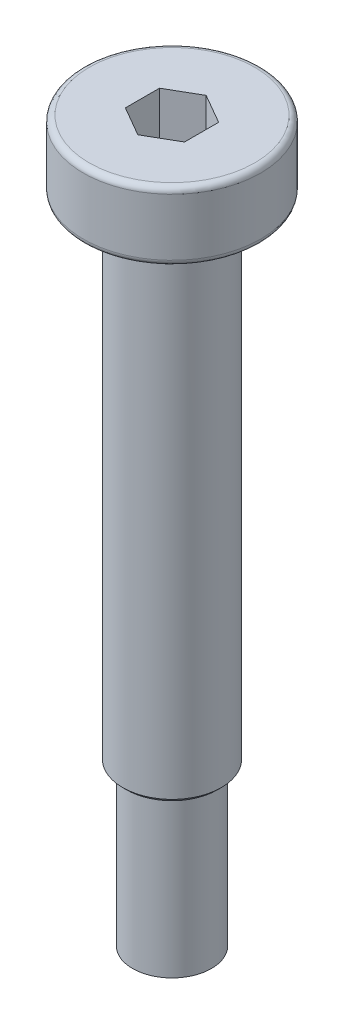
ISO-10303-21;
HEADER;
FILE_DESCRIPTION(('STEP AP214'),'2;1');
FILE_NAME('part.step','',(''),(''),'','','');
FILE_SCHEMA(('AUTOMOTIVE_DESIGN { 1 0 10303 214 1 1 1 1 }'));
ENDSEC;
DATA;
#1=APPLICATION_CONTEXT('core data for automotive mechanical design processes');
#2=APPLICATION_PROTOCOL_DEFINITION('international standard','automotive_design',2000,#1);
#3=PRODUCT_CONTEXT('',#1,'mechanical');
#4=PRODUCT('Part','Part','',(#3));
#5=PRODUCT_RELATED_PRODUCT_CATEGORY('part','',(#4));
#6=PRODUCT_DEFINITION_FORMATION('','',#4);
#7=PRODUCT_DEFINITION_CONTEXT('part definition',#1,'design');
#8=PRODUCT_DEFINITION('design','',#6,#7);
#9=PRODUCT_DEFINITION_SHAPE('','',#8);
#10=(LENGTH_UNIT() NAMED_UNIT(*) SI_UNIT(.MILLI.,.METRE.));
#11=(NAMED_UNIT(*) PLANE_ANGLE_UNIT() SI_UNIT($,.RADIAN.));
#12=(NAMED_UNIT(*) SI_UNIT($,.STERADIAN.) SOLID_ANGLE_UNIT());
#13=UNCERTAINTY_MEASURE_WITH_UNIT(LENGTH_MEASURE(1.E-05),#10,'distance_accuracy_value','');
#14=(GEOMETRIC_REPRESENTATION_CONTEXT(3) GLOBAL_UNCERTAINTY_ASSIGNED_CONTEXT((#13)) GLOBAL_UNIT_ASSIGNED_CONTEXT((#10,
#11,#12)) REPRESENTATION_CONTEXT('',''));
#15=CARTESIAN_POINT('',(0.,0.,0.));
#16=DIRECTION('',(0.,0.,1.));
#17=DIRECTION('',(1.,0.,0.));
#18=AXIS2_PLACEMENT_3D('',#15,#16,#17);
#19=CARTESIAN_POINT('',(0.,3.5,0.));
#20=DIRECTION('',(0.,1.,0.));
#21=DIRECTION('',(-1.,0.,0.));
#22=AXIS2_PLACEMENT_3D('',#19,#20,#21);
#23=CYLINDRICAL_SURFACE('',#22,4.5);
#24=CARTESIAN_POINT('',(0.,0.3,0.));
#25=DIRECTION('',(0.,-1.,0.));
#26=DIRECTION('',(1.,0.,0.));
#27=AXIS2_PLACEMENT_3D('',#24,#25,#26);
#28=CIRCLE('',#27,4.5);
#29=CARTESIAN_POINT('',(4.5,0.300000000000001,0.));
#30=VERTEX_POINT('',#29);
#31=EDGE_CURVE('E188',#30,#30,#28,.F.);
#32=ORIENTED_EDGE('',*,*,#31,.T.);
#33=EDGE_LOOP('',(#32));
#34=FACE_BOUND('',#33,.T.);
#35=CARTESIAN_POINT('',(0.,3.2,0.));
#36=DIRECTION('',(0.,1.,0.));
#37=DIRECTION('',(-1.,0.,0.));
#38=AXIS2_PLACEMENT_3D('',#35,#36,#37);
#39=CIRCLE('',#38,4.5);
#40=CARTESIAN_POINT('',(-4.5,3.2,0.));
#41=VERTEX_POINT('',#40);
#42=EDGE_CURVE('E184',#41,#41,#39,.F.);
#43=ORIENTED_EDGE('',*,*,#42,.T.);
#44=EDGE_LOOP('',(#43));
#45=FACE_BOUND('',#44,.T.);
#46=ADVANCED_FACE('F47',(#34,#45),#23,.T.);
#47=CARTESIAN_POINT('',(-4.5,0.,0.));
#48=DIRECTION('',(0.,-1.,0.));
#49=DIRECTION('',(1.,0.,0.));
#50=AXIS2_PLACEMENT_3D('',#47,#48,#49);
#51=PLANE('',#50);
#52=CARTESIAN_POINT('',(0.,0.,0.));
#53=DIRECTION('',(0.,-1.,0.));
#54=DIRECTION('',(1.,0.,0.));
#55=AXIS2_PLACEMENT_3D('',#52,#53,#54);
#56=CIRCLE('',#55,4.2);
#57=CARTESIAN_POINT('',(4.2,0.,0.));
#58=VERTEX_POINT('',#57);
#59=EDGE_CURVE('E192',#58,#58,#56,.T.);
#60=ORIENTED_EDGE('',*,*,#59,.T.);
#61=EDGE_LOOP('',(#60));
#62=FACE_BOUND('',#61,.T.);
#63=CARTESIAN_POINT('',(0.,0.,0.));
#64=DIRECTION('',(0.,1.,0.));
#65=DIRECTION('',(-1.,0.,0.));
#66=AXIS2_PLACEMENT_3D('',#63,#64,#65);
#67=CIRCLE('',#66,2.5);
#68=CARTESIAN_POINT('',(-2.5,0.,0.));
#69=VERTEX_POINT('',#68);
#70=EDGE_CURVE('E180',#69,#69,#67,.T.);
#71=ORIENTED_EDGE('',*,*,#70,.T.);
#72=EDGE_LOOP('',(#71));
#73=FACE_BOUND('',#72,.T.);
#74=ADVANCED_FACE('F216',(#62,#73),#51,.T.);
#75=CARTESIAN_POINT('',(0.,3.5,0.));
#76=DIRECTION('',(0.,1.,0.));
#77=DIRECTION('',(-1.,0.,0.));
#78=AXIS2_PLACEMENT_3D('',#75,#76,#77);
#79=CYLINDRICAL_SURFACE('',#78,2.5);
#80=CARTESIAN_POINT('',(0.,-24.8,0.));
#81=DIRECTION('',(0.,-1.,0.));
#82=DIRECTION('',(1.,0.,0.));
#83=AXIS2_PLACEMENT_3D('',#80,#81,#82);
#84=CIRCLE('',#83,2.5);
#85=CARTESIAN_POINT('',(2.5,-24.8,0.));
#86=VERTEX_POINT('',#85);
#87=EDGE_CURVE('E56',#86,#86,#84,.F.);
#88=ORIENTED_EDGE('',*,*,#87,.T.);
#89=EDGE_LOOP('',(#88));
#90=FACE_BOUND('',#89,.T.);
#91=ORIENTED_EDGE('',*,*,#70,.F.);
#92=EDGE_LOOP('',(#91));
#93=FACE_BOUND('',#92,.T.);
#94=ADVANCED_FACE('F204',(#90,#93),#79,.T.);
#95=CARTESIAN_POINT('',(-2.5,-25.,0.));
#96=DIRECTION('',(0.,-1.,0.));
#97=DIRECTION('',(1.,0.,0.));
#98=AXIS2_PLACEMENT_3D('',#95,#96,#97);
#99=PLANE('',#98);
#100=CARTESIAN_POINT('',(0.,-25.,0.));
#101=DIRECTION('',(0.,-1.,0.));
#102=DIRECTION('',(1.,0.,0.));
#103=AXIS2_PLACEMENT_3D('',#100,#101,#102);
#104=CIRCLE('',#103,2.3);
#105=CARTESIAN_POINT('',(2.3,-25.,0.));
#106=VERTEX_POINT('',#105);
#107=EDGE_CURVE('E11',#106,#106,#104,.T.);
#108=ORIENTED_EDGE('',*,*,#107,.T.);
#109=EDGE_LOOP('',(#108));
#110=FACE_BOUND('',#109,.T.);
#111=CARTESIAN_POINT('',(0.,-25.,0.));
#112=DIRECTION('',(0.,1.,0.));
#113=DIRECTION('',(-1.,0.,0.));
#114=AXIS2_PLACEMENT_3D('',#111,#112,#113);
#115=CIRCLE('',#114,2.);
#116=CARTESIAN_POINT('',(-2.,-25.,0.));
#117=VERTEX_POINT('',#116);
#118=EDGE_CURVE('E176',#117,#117,#115,.T.);
#119=ORIENTED_EDGE('',*,*,#118,.T.);
#120=EDGE_LOOP('',(#119));
#121=FACE_BOUND('',#120,.T.);
#122=ADVANCED_FACE('F258',(#110,#121),#99,.T.);
#123=CARTESIAN_POINT('',(0.,3.5,0.));
#124=DIRECTION('',(0.,1.,0.));
#125=DIRECTION('',(-1.,0.,0.));
#126=AXIS2_PLACEMENT_3D('',#123,#124,#125);
#127=CYLINDRICAL_SURFACE('',#126,2.);
#128=CARTESIAN_POINT('',(0.,-33.,0.));
#129=DIRECTION('',(0.,1.,0.));
#130=DIRECTION('',(-1.,0.,0.));
#131=AXIS2_PLACEMENT_3D('',#128,#129,#130);
#132=CIRCLE('',#131,2.);
#133=CARTESIAN_POINT('',(-2.,-33.,0.));
#134=VERTEX_POINT('',#133);
#135=EDGE_CURVE('E163',#134,#134,#132,.T.);
#136=ORIENTED_EDGE('',*,*,#135,.T.);
#137=EDGE_LOOP('',(#136));
#138=FACE_BOUND('',#137,.T.);
#139=ORIENTED_EDGE('',*,*,#118,.F.);
#140=EDGE_LOOP('',(#139));
#141=FACE_BOUND('',#140,.T.);
#142=ADVANCED_FACE('F251',(#138,#141),#127,.T.);
#143=CARTESIAN_POINT('',(-2.,-33.,0.));
#144=DIRECTION('',(0.,-1.,0.));
#145=DIRECTION('',(1.,0.,0.));
#146=AXIS2_PLACEMENT_3D('',#143,#144,#145);
#147=PLANE('',#146);
#148=ORIENTED_EDGE('',*,*,#135,.F.);
#149=EDGE_LOOP('',(#148));
#150=FACE_BOUND('',#149,.T.);
#151=ADVANCED_FACE('F245',(#150),#147,.T.);
#152=CARTESIAN_POINT('',(0.,3.5,0.));
#153=DIRECTION('',(0.,1.,0.));
#154=DIRECTION('',(-1.,0.,0.));
#155=AXIS2_PLACEMENT_3D('',#152,#153,#154);
#156=PLANE('',#155);
#157=DIRECTION('',(-0.866025403784439,0.,-0.5));
#158=VECTOR('',#157,1.);
#159=CARTESIAN_POINT('',(1.5,3.5,-0.866025403784439));
#160=LINE('',#159,#158);
#161=CARTESIAN_POINT('',(1.5,3.5,-0.866025403784439));
#162=VERTEX_POINT('',#161);
#163=CARTESIAN_POINT('',(0.,3.5,-1.73205080756888));
#164=VERTEX_POINT('',#163);
#165=EDGE_CURVE('E63',#162,#164,#160,.T.);
#166=ORIENTED_EDGE('',*,*,#165,.F.);
#167=DIRECTION('',(0.,0.,-1.));
#168=VECTOR('',#167,1.);
#169=CARTESIAN_POINT('',(1.5,3.5,0.86602540378444));
#170=LINE('',#169,#168);
#171=CARTESIAN_POINT('',(1.5,3.5,0.86602540378444));
#172=VERTEX_POINT('',#171);
#173=EDGE_CURVE('E157',#172,#162,#170,.T.);
#174=ORIENTED_EDGE('',*,*,#173,.F.);
#175=DIRECTION('',(0.866025403784439,0.,-0.5));
#176=VECTOR('',#175,1.);
#177=CARTESIAN_POINT('',(0.,3.5,1.73205080756888));
#178=LINE('',#177,#176);
#179=CARTESIAN_POINT('',(0.,3.5,1.73205080756888));
#180=VERTEX_POINT('',#179);
#181=EDGE_CURVE('E154',#180,#172,#178,.T.);
#182=ORIENTED_EDGE('',*,*,#181,.F.);
#183=DIRECTION('',(0.866025403784438,0.,0.5));
#184=VECTOR('',#183,1.);
#185=CARTESIAN_POINT('',(-1.5,3.5,0.866025403784439));
#186=LINE('',#185,#184);
#187=CARTESIAN_POINT('',(-1.5,3.5,0.866025403784439));
#188=VERTEX_POINT('',#187);
#189=EDGE_CURVE('E111',#188,#180,#186,.T.);
#190=ORIENTED_EDGE('',*,*,#189,.F.);
#191=DIRECTION('',(0.,0.,1.));
#192=VECTOR('',#191,1.);
#193=CARTESIAN_POINT('',(-1.5,3.5,-0.866025403784438));
#194=LINE('',#193,#192);
#195=CARTESIAN_POINT('',(-1.5,3.5,-0.866025403784438));
#196=VERTEX_POINT('',#195);
#197=EDGE_CURVE('E148',#196,#188,#194,.T.);
#198=ORIENTED_EDGE('',*,*,#197,.F.);
#199=DIRECTION('',(-0.866025403784439,0.,0.5));
#200=VECTOR('',#199,1.);
#201=CARTESIAN_POINT('',(0.,3.5,-1.73205080756888));
#202=LINE('',#201,#200);
#203=EDGE_CURVE('E144',#164,#196,#202,.T.);
#204=ORIENTED_EDGE('',*,*,#203,.F.);
#205=EDGE_LOOP('',(#166,#174,#182,#190,#198,#204));
#206=FACE_BOUND('',#205,.T.);
#207=CARTESIAN_POINT('',(0.,3.5,0.));
#208=DIRECTION('',(0.,1.,0.));
#209=DIRECTION('',(-1.,0.,0.));
#210=AXIS2_PLACEMENT_3D('',#207,#208,#209);
#211=CIRCLE('',#210,4.2);
#212=CARTESIAN_POINT('',(-4.2,3.5,0.));
#213=VERTEX_POINT('',#212);
#214=EDGE_CURVE('E196',#213,#213,#211,.T.);
#215=ORIENTED_EDGE('',*,*,#214,.T.);
#216=EDGE_LOOP('',(#215));
#217=FACE_BOUND('',#216,.T.);
#218=ADVANCED_FACE('F230',(#206,#217),#156,.T.);
#219=CARTESIAN_POINT('',(0.,0.3,0.));
#220=DIRECTION('',(0.,-1.,0.));
#221=DIRECTION('',(1.,0.,0.));
#222=AXIS2_PLACEMENT_3D('',#219,#220,#221);
#223=TOROIDAL_SURFACE('',#222,4.2,0.3);
#224=ORIENTED_EDGE('',*,*,#59,.F.);
#225=EDGE_LOOP('',(#224));
#226=FACE_BOUND('',#225,.T.);
#227=ORIENTED_EDGE('',*,*,#31,.F.);
#228=EDGE_LOOP('',(#227));
#229=FACE_BOUND('',#228,.T.);
#230=ADVANCED_FACE('F227',(#226,#229),#223,.T.);
#231=CARTESIAN_POINT('',(0.,3.2,0.));
#232=DIRECTION('',(0.,1.,0.));
#233=DIRECTION('',(-1.,0.,0.));
#234=AXIS2_PLACEMENT_3D('',#231,#232,#233);
#235=TOROIDAL_SURFACE('',#234,4.2,0.3);
#236=ORIENTED_EDGE('',*,*,#42,.F.);
#237=EDGE_LOOP('',(#236));
#238=FACE_BOUND('',#237,.T.);
#239=ORIENTED_EDGE('',*,*,#214,.F.);
#240=EDGE_LOOP('',(#239));
#241=FACE_BOUND('',#240,.T.);
#242=ADVANCED_FACE('F229',(#238,#241),#235,.T.);
#243=CARTESIAN_POINT('',(1.5,1.1,-0.866025403784439));
#244=DIRECTION('',(0.5,0.,-0.866025403784439));
#245=DIRECTION('',(-0.866025403784439,0.,-0.5));
#246=AXIS2_PLACEMENT_3D('',#243,#244,#245);
#247=PLANE('',#246);
#248=ORIENTED_EDGE('',*,*,#165,.T.);
#249=DIRECTION('',(0.,1.,0.));
#250=VECTOR('',#249,1.);
#251=CARTESIAN_POINT('',(0.,1.1,-1.73205080756888));
#252=LINE('',#251,#250);
#253=CARTESIAN_POINT('',(0.,1.1,-1.73205080756888));
#254=VERTEX_POINT('',#253);
#255=EDGE_CURVE('E93',#254,#164,#252,.T.);
#256=ORIENTED_EDGE('',*,*,#255,.F.);
#257=DIRECTION('',(-0.866025403784439,0.,-0.5));
#258=VECTOR('',#257,1.);
#259=CARTESIAN_POINT('',(1.5,1.1,-0.866025403784439));
#260=LINE('',#259,#258);
#261=CARTESIAN_POINT('',(1.5,1.1,-0.866025403784439));
#262=VERTEX_POINT('',#261);
#263=EDGE_CURVE('E160',#262,#254,#260,.T.);
#264=ORIENTED_EDGE('',*,*,#263,.F.);
#265=DIRECTION('',(0.,1.,0.));
#266=VECTOR('',#265,1.);
#267=CARTESIAN_POINT('',(1.5,1.1,-0.866025403784439));
#268=LINE('',#267,#266);
#269=EDGE_CURVE('E71',#262,#162,#268,.T.);
#270=ORIENTED_EDGE('',*,*,#269,.T.);
#271=EDGE_LOOP('',(#248,#256,#264,#270));
#272=FACE_BOUND('',#271,.T.);
#273=ADVANCED_FACE('F233',(#272),#247,.F.);
#274=CARTESIAN_POINT('',(1.5,1.1,0.86602540378444));
#275=DIRECTION('',(1.,0.,0.));
#276=DIRECTION('',(0.,1.,0.));
#277=AXIS2_PLACEMENT_3D('',#274,#275,#276);
#278=PLANE('',#277);
#279=ORIENTED_EDGE('',*,*,#173,.T.);
#280=ORIENTED_EDGE('',*,*,#269,.F.);
#281=DIRECTION('',(0.,0.,-1.));
#282=VECTOR('',#281,1.);
#283=CARTESIAN_POINT('',(1.5,1.1,0.86602540378444));
#284=LINE('',#283,#282);
#285=CARTESIAN_POINT('',(1.5,1.1,0.86602540378444));
#286=VERTEX_POINT('',#285);
#287=EDGE_CURVE('E125',#286,#262,#284,.T.);
#288=ORIENTED_EDGE('',*,*,#287,.F.);
#289=DIRECTION('',(0.,1.,0.));
#290=VECTOR('',#289,1.);
#291=CARTESIAN_POINT('',(1.5,1.1,0.86602540378444));
#292=LINE('',#291,#290);
#293=EDGE_CURVE('E116',#286,#172,#292,.T.);
#294=ORIENTED_EDGE('',*,*,#293,.T.);
#295=EDGE_LOOP('',(#279,#280,#288,#294));
#296=FACE_BOUND('',#295,.T.);
#297=ADVANCED_FACE('F238',(#296),#278,.F.);
#298=CARTESIAN_POINT('',(0.,1.1,1.73205080756888));
#299=DIRECTION('',(0.5,0.,0.866025403784439));
#300=DIRECTION('',(0.866025403784439,0.,-0.5));
#301=AXIS2_PLACEMENT_3D('',#298,#299,#300);
#302=PLANE('',#301);
#303=ORIENTED_EDGE('',*,*,#181,.T.);
#304=ORIENTED_EDGE('',*,*,#293,.F.);
#305=DIRECTION('',(0.866025403784439,0.,-0.5));
#306=VECTOR('',#305,1.);
#307=CARTESIAN_POINT('',(0.,1.1,1.73205080756888));
#308=LINE('',#307,#306);
#309=CARTESIAN_POINT('',(0.,1.1,1.73205080756888));
#310=VERTEX_POINT('',#309);
#311=EDGE_CURVE('E120',#310,#286,#308,.T.);
#312=ORIENTED_EDGE('',*,*,#311,.F.);
#313=DIRECTION('',(0.,1.,0.));
#314=VECTOR('',#313,1.);
#315=CARTESIAN_POINT('',(0.,1.1,1.73205080756888));
#316=LINE('',#315,#314);
#317=EDGE_CURVE('E104',#310,#180,#316,.T.);
#318=ORIENTED_EDGE('',*,*,#317,.T.);
#319=EDGE_LOOP('',(#303,#304,#312,#318));
#320=FACE_BOUND('',#319,.T.);
#321=ADVANCED_FACE('F121',(#320),#302,.F.);
#322=CARTESIAN_POINT('',(-1.5,1.1,0.866025403784439));
#323=DIRECTION('',(-0.5,0.,0.866025403784438));
#324=DIRECTION('',(0.866025403784439,0.,0.5));
#325=AXIS2_PLACEMENT_3D('',#322,#323,#324);
#326=PLANE('',#325);
#327=ORIENTED_EDGE('',*,*,#189,.T.);
#328=ORIENTED_EDGE('',*,*,#317,.F.);
#329=DIRECTION('',(0.866025403784438,0.,0.5));
#330=VECTOR('',#329,1.);
#331=CARTESIAN_POINT('',(-1.5,1.1,0.866025403784439));
#332=LINE('',#331,#330);
#333=CARTESIAN_POINT('',(-1.5,1.1,0.866025403784439));
#334=VERTEX_POINT('',#333);
#335=EDGE_CURVE('E108',#334,#310,#332,.T.);
#336=ORIENTED_EDGE('',*,*,#335,.F.);
#337=DIRECTION('',(0.,1.,0.));
#338=VECTOR('',#337,1.);
#339=CARTESIAN_POINT('',(-1.5,1.1,0.866025403784439));
#340=LINE('',#339,#338);
#341=EDGE_CURVE('E117',#334,#188,#340,.T.);
#342=ORIENTED_EDGE('',*,*,#341,.T.);
#343=EDGE_LOOP('',(#327,#328,#336,#342));
#344=FACE_BOUND('',#343,.T.);
#345=ADVANCED_FACE('F106',(#344),#326,.F.);
#346=CARTESIAN_POINT('',(-1.5,1.1,-0.866025403784438));
#347=DIRECTION('',(-1.,0.,0.));
#348=DIRECTION('',(0.,-1.,0.));
#349=AXIS2_PLACEMENT_3D('',#346,#347,#348);
#350=PLANE('',#349);
#351=ORIENTED_EDGE('',*,*,#197,.T.);
#352=ORIENTED_EDGE('',*,*,#341,.F.);
#353=DIRECTION('',(0.,0.,1.));
#354=VECTOR('',#353,1.);
#355=CARTESIAN_POINT('',(-1.5,1.1,-0.866025403784438));
#356=LINE('',#355,#354);
#357=CARTESIAN_POINT('',(-1.5,1.1,-0.866025403784438));
#358=VERTEX_POINT('',#357);
#359=EDGE_CURVE('E131',#358,#334,#356,.T.);
#360=ORIENTED_EDGE('',*,*,#359,.F.);
#361=DIRECTION('',(0.,1.,0.));
#362=VECTOR('',#361,1.);
#363=CARTESIAN_POINT('',(-1.5,1.1,-0.866025403784438));
#364=LINE('',#363,#362);
#365=EDGE_CURVE('E168',#358,#196,#364,.T.);
#366=ORIENTED_EDGE('',*,*,#365,.T.);
#367=EDGE_LOOP('',(#351,#352,#360,#366));
#368=FACE_BOUND('',#367,.T.);
#369=ADVANCED_FACE('F335',(#368),#350,.F.);
#370=CARTESIAN_POINT('',(0.,1.1,-1.73205080756888));
#371=DIRECTION('',(-0.5,0.,-0.866025403784439));
#372=DIRECTION('',(-0.866025403784439,0.,0.5));
#373=AXIS2_PLACEMENT_3D('',#370,#371,#372);
#374=PLANE('',#373);
#375=ORIENTED_EDGE('',*,*,#203,.T.);
#376=ORIENTED_EDGE('',*,*,#365,.F.);
#377=DIRECTION('',(-0.866025403784439,0.,0.5));
#378=VECTOR('',#377,1.);
#379=CARTESIAN_POINT('',(0.,1.1,-1.73205080756888));
#380=LINE('',#379,#378);
#381=EDGE_CURVE('E136',#254,#358,#380,.T.);
#382=ORIENTED_EDGE('',*,*,#381,.F.);
#383=ORIENTED_EDGE('',*,*,#255,.T.);
#384=EDGE_LOOP('',(#375,#376,#382,#383));
#385=FACE_BOUND('',#384,.T.);
#386=ADVANCED_FACE('F212',(#385),#374,.F.);
#387=CARTESIAN_POINT('',(0.,1.1,0.));
#388=DIRECTION('',(0.,1.,0.));
#389=DIRECTION('',(0.,0.,1.));
#390=AXIS2_PLACEMENT_3D('',#387,#388,#389);
#391=PLANE('',#390);
#392=ORIENTED_EDGE('',*,*,#263,.T.);
#393=ORIENTED_EDGE('',*,*,#381,.T.);
#394=ORIENTED_EDGE('',*,*,#359,.T.);
#395=ORIENTED_EDGE('',*,*,#335,.T.);
#396=ORIENTED_EDGE('',*,*,#311,.T.);
#397=ORIENTED_EDGE('',*,*,#287,.T.);
#398=EDGE_LOOP('',(#392,#393,#394,#395,#396,#397));
#399=FACE_BOUND('',#398,.T.);
#400=ADVANCED_FACE('F128',(#399),#391,.T.);
#401=CARTESIAN_POINT('',(0.,-24.8,0.));
#402=DIRECTION('',(0.,1.,0.));
#403=DIRECTION('',(-1.,0.,0.));
#404=AXIS2_PLACEMENT_3D('',#401,#402,#403);
#405=CONICAL_SURFACE('',#404,2.5,0.785398163397445);
#406=ORIENTED_EDGE('',*,*,#107,.F.);
#407=EDGE_LOOP('',(#406));
#408=FACE_BOUND('',#407,.T.);
#409=ORIENTED_EDGE('',*,*,#87,.F.);
#410=EDGE_LOOP('',(#409));
#411=FACE_BOUND('',#410,.T.);
#412=ADVANCED_FACE('F49',(#408,#411),#405,.T.);
#413=CLOSED_SHELL('',(#46,#74,#94,#122,#142,#151,#218,#230,#242,#273,#297,#321,#345,#369,#386,
#400,#412));
#414=MANIFOLD_SOLID_BREP('B2',#413);
#415=ADVANCED_BREP_SHAPE_REPRESENTATION('',(#18,#414),#14);
#416=SHAPE_DEFINITION_REPRESENTATION(#9,#415);
ENDSEC;
END-ISO-10303-21;
